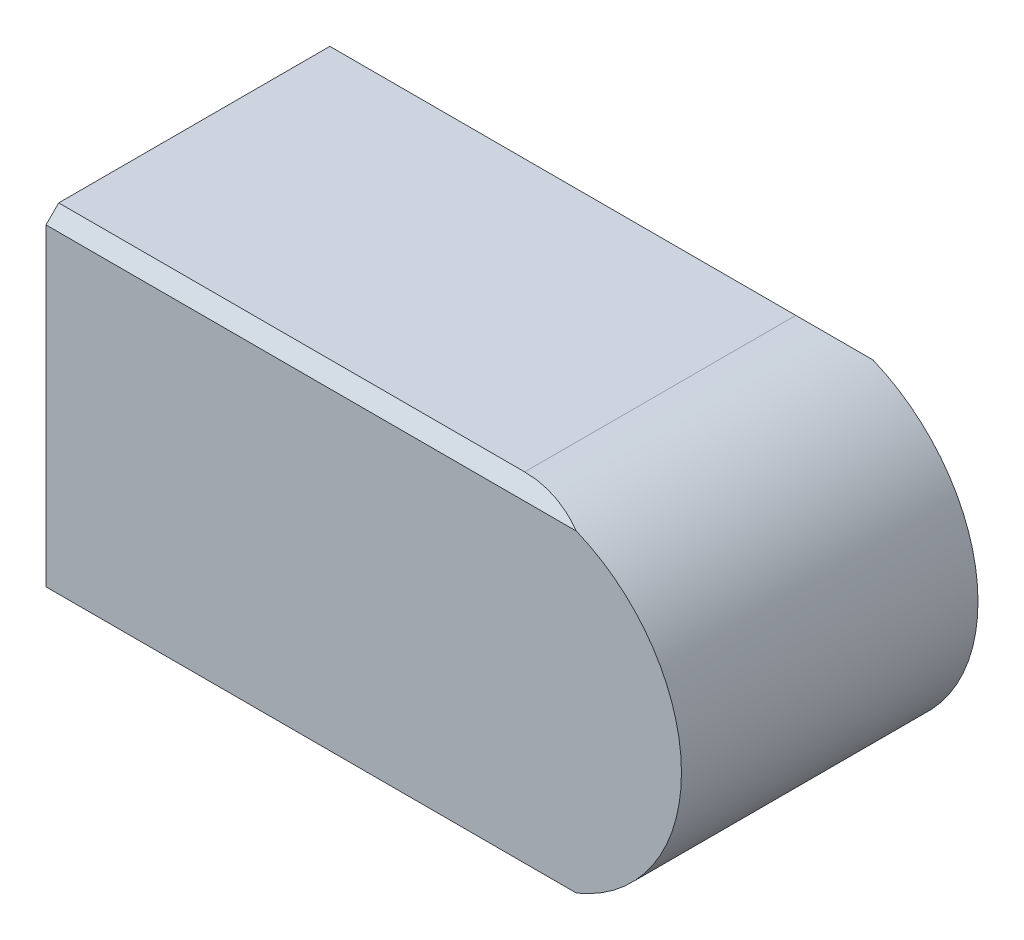
ISO-10303-21;
HEADER;
FILE_DESCRIPTION(('STEP AP214'),'2;1');
FILE_NAME('part.step','',(''),(''),'','','');
FILE_SCHEMA(('AUTOMOTIVE_DESIGN { 1 0 10303 214 1 1 1 1 }'));
ENDSEC;
DATA;
#1=APPLICATION_CONTEXT('core data for automotive mechanical design processes');
#2=APPLICATION_PROTOCOL_DEFINITION('international standard','automotive_design',2000,#1);
#3=PRODUCT_CONTEXT('',#1,'mechanical');
#4=PRODUCT('Part','Part','',(#3));
#5=PRODUCT_RELATED_PRODUCT_CATEGORY('part','',(#4));
#6=PRODUCT_DEFINITION_FORMATION('','',#4);
#7=PRODUCT_DEFINITION_CONTEXT('part definition',#1,'design');
#8=PRODUCT_DEFINITION('design','',#6,#7);
#9=PRODUCT_DEFINITION_SHAPE('','',#8);
#10=(LENGTH_UNIT() NAMED_UNIT(*) SI_UNIT(.MILLI.,.METRE.));
#11=(NAMED_UNIT(*) PLANE_ANGLE_UNIT() SI_UNIT($,.RADIAN.));
#12=(NAMED_UNIT(*) SI_UNIT($,.STERADIAN.) SOLID_ANGLE_UNIT());
#13=UNCERTAINTY_MEASURE_WITH_UNIT(LENGTH_MEASURE(1.E-05),#10,'distance_accuracy_value','');
#14=(GEOMETRIC_REPRESENTATION_CONTEXT(3) GLOBAL_UNCERTAINTY_ASSIGNED_CONTEXT((#13)) GLOBAL_UNIT_ASSIGNED_CONTEXT((#10,
#11,#12)) REPRESENTATION_CONTEXT('',''));
#15=CARTESIAN_POINT('',(0.,0.,0.));
#16=DIRECTION('',(0.,0.,1.));
#17=DIRECTION('',(1.,0.,0.));
#18=AXIS2_PLACEMENT_3D('',#15,#16,#17);
#19=CARTESIAN_POINT('',(15.,0.,0.3));
#20=DIRECTION('',(0.,0.707106781186547,0.707106781186548));
#21=DIRECTION('',(0.,-0.707106781186548,0.707106781186547));
#22=AXIS2_PLACEMENT_3D('',#19,#20,#21);
#23=PLANE('',#22);
#24=DIRECTION('',(0.,-0.707106781186548,0.707106781186547));
#25=VECTOR('',#24,1.);
#26=CARTESIAN_POINT('',(0.,0.,0.3));
#27=LINE('',#26,#25);
#28=CARTESIAN_POINT('',(0.,0.3,0.));
#29=VERTEX_POINT('',#28);
#30=CARTESIAN_POINT('',(0.,0.,0.299999999999992));
#31=VERTEX_POINT('',#30);
#32=EDGE_CURVE('E73',#29,#31,#27,.T.);
#33=ORIENTED_EDGE('',*,*,#32,.F.);
#34=DIRECTION('',(1.,0.,0.));
#35=VECTOR('',#34,1.);
#36=CARTESIAN_POINT('',(11.,0.3,0.));
#37=LINE('',#36,#35);
#38=CARTESIAN_POINT('',(12.519868415357,0.3,0.));
#39=VERTEX_POINT('',#38);
#40=EDGE_CURVE('E76',#29,#39,#37,.T.);
#41=ORIENTED_EDGE('',*,*,#40,.T.);
#42=CARTESIAN_POINT('',(11.,4.00000000000001,-3.7));
#43=DIRECTION('',(0.,0.707106781186547,0.707106781186548));
#44=DIRECTION('',(0.,-0.707106781186548,0.707106781186547));
#45=AXIS2_PLACEMENT_3D('',#42,#43,#44);
#46=ELLIPSE('',#45,5.65685424949236,3.99999999999999);
#47=CARTESIAN_POINT('',(11.,0.,0.29999999999998));
#48=VERTEX_POINT('',#47);
#49=EDGE_CURVE('E20',#48,#39,#46,.T.);
#50=ORIENTED_EDGE('',*,*,#49,.F.);
#51=DIRECTION('',(1.,0.,0.));
#52=VECTOR('',#51,1.);
#53=CARTESIAN_POINT('',(0.,0.,0.29999999999998));
#54=LINE('',#53,#52);
#55=EDGE_CURVE('E82',#48,#31,#54,.F.);
#56=ORIENTED_EDGE('',*,*,#55,.T.);
#57=EDGE_LOOP('',(#33,#41,#50,#56));
#58=FACE_BOUND('',#57,.T.);
#59=ADVANCED_FACE('F17',(#58),#23,.F.);
#60=CARTESIAN_POINT('',(15.,7.7,0.));
#61=DIRECTION('',(0.,-0.707106781186548,0.707106781186547));
#62=DIRECTION('',(0.,-0.707106781186547,-0.707106781186548));
#63=AXIS2_PLACEMENT_3D('',#60,#61,#62);
#64=PLANE('',#63);
#65=DIRECTION('',(0.,-0.707106781186547,-0.707106781186548));
#66=VECTOR('',#65,1.);
#67=CARTESIAN_POINT('',(0.,7.7,0.));
#68=LINE('',#67,#66);
#69=CARTESIAN_POINT('',(0.,8.,0.299999999999999));
#70=VERTEX_POINT('',#69);
#71=CARTESIAN_POINT('',(0.,7.70000000000001,0.));
#72=VERTEX_POINT('',#71);
#73=EDGE_CURVE('E100',#70,#72,#68,.T.);
#74=ORIENTED_EDGE('',*,*,#73,.F.);
#75=DIRECTION('',(1.,0.,0.));
#76=VECTOR('',#75,1.);
#77=CARTESIAN_POINT('',(11.,8.,0.3));
#78=LINE('',#77,#76);
#79=CARTESIAN_POINT('',(11.,8.,0.3));
#80=VERTEX_POINT('',#79);
#81=EDGE_CURVE('E104',#70,#80,#78,.T.);
#82=ORIENTED_EDGE('',*,*,#81,.T.);
#83=CARTESIAN_POINT('',(11.,4.00000000000001,-3.7));
#84=DIRECTION('',(0.,-0.707106781186548,0.707106781186547));
#85=DIRECTION('',(0.,0.707106781186547,0.707106781186548));
#86=AXIS2_PLACEMENT_3D('',#83,#84,#85);
#87=ELLIPSE('',#86,5.65685424949237,3.99999999999999);
#88=CARTESIAN_POINT('',(12.5198684153571,7.70000000000001,0.));
#89=VERTEX_POINT('',#88);
#90=EDGE_CURVE('E99',#89,#80,#87,.T.);
#91=ORIENTED_EDGE('',*,*,#90,.F.);
#92=DIRECTION('',(1.,0.,0.));
#93=VECTOR('',#92,1.);
#94=CARTESIAN_POINT('',(11.,7.70000000000001,0.));
#95=LINE('',#94,#93);
#96=EDGE_CURVE('E81',#89,#72,#95,.F.);
#97=ORIENTED_EDGE('',*,*,#96,.T.);
#98=EDGE_LOOP('',(#74,#82,#91,#97));
#99=FACE_BOUND('',#98,.T.);
#100=ADVANCED_FACE('F195',(#99),#64,.F.);
#101=CARTESIAN_POINT('',(11.,8.,7.));
#102=DIRECTION('',(0.,-1.,0.));
#103=DIRECTION('',(0.,0.,-1.));
#104=AXIS2_PLACEMENT_3D('',#101,#102,#103);
#105=PLANE('',#104);
#106=DIRECTION('',(1.,0.,0.));
#107=VECTOR('',#106,1.);
#108=CARTESIAN_POINT('',(15.,8.,6.7));
#109=LINE('',#108,#107);
#110=CARTESIAN_POINT('',(0.,8.,6.7));
#111=VERTEX_POINT('',#110);
#112=CARTESIAN_POINT('',(11.,8.,6.7));
#113=VERTEX_POINT('',#112);
#114=EDGE_CURVE('E129',#111,#113,#109,.T.);
#115=ORIENTED_EDGE('',*,*,#114,.T.);
#116=DIRECTION('',(0.,0.,1.));
#117=VECTOR('',#116,1.);
#118=CARTESIAN_POINT('',(11.,8.,7.));
#119=LINE('',#118,#117);
#120=EDGE_CURVE('E98',#80,#113,#119,.T.);
#121=ORIENTED_EDGE('',*,*,#120,.F.);
#122=ORIENTED_EDGE('',*,*,#81,.F.);
#123=DIRECTION('',(0.,0.,-1.));
#124=VECTOR('',#123,1.);
#125=CARTESIAN_POINT('',(0.,8.,7.));
#126=LINE('',#125,#124);
#127=EDGE_CURVE('E116',#70,#111,#126,.F.);
#128=ORIENTED_EDGE('',*,*,#127,.T.);
#129=EDGE_LOOP('',(#115,#121,#122,#128));
#130=FACE_BOUND('',#129,.T.);
#131=ADVANCED_FACE('F192',(#130),#105,.F.);
#132=CARTESIAN_POINT('',(0.,0.,7.));
#133=DIRECTION('',(0.,1.,0.));
#134=DIRECTION('',(0.,0.,1.));
#135=AXIS2_PLACEMENT_3D('',#132,#133,#134);
#136=PLANE('',#135);
#137=ORIENTED_EDGE('',*,*,#55,.F.);
#138=DIRECTION('',(0.,0.,1.));
#139=VECTOR('',#138,1.);
#140=CARTESIAN_POINT('',(11.,0.,7.));
#141=LINE('',#140,#139);
#142=CARTESIAN_POINT('',(11.,0.,6.70000000000001));
#143=VERTEX_POINT('',#142);
#144=EDGE_CURVE('E72',#143,#48,#141,.F.);
#145=ORIENTED_EDGE('',*,*,#144,.F.);
#146=DIRECTION('',(1.,0.,0.));
#147=VECTOR('',#146,1.);
#148=CARTESIAN_POINT('',(15.,0.,6.7));
#149=LINE('',#148,#147);
#150=CARTESIAN_POINT('',(0.,0.,6.7));
#151=VERTEX_POINT('',#150);
#152=EDGE_CURVE('E148',#143,#151,#149,.F.);
#153=ORIENTED_EDGE('',*,*,#152,.T.);
#154=DIRECTION('',(0.,0.,-1.));
#155=VECTOR('',#154,1.);
#156=CARTESIAN_POINT('',(0.,0.,7.));
#157=LINE('',#156,#155);
#158=EDGE_CURVE('E117',#151,#31,#157,.T.);
#159=ORIENTED_EDGE('',*,*,#158,.T.);
#160=EDGE_LOOP('',(#137,#145,#153,#159));
#161=FACE_BOUND('',#160,.T.);
#162=ADVANCED_FACE('F177',(#161),#136,.F.);
#163=CARTESIAN_POINT('',(11.,4.,0.));
#164=DIRECTION('',(0.,0.,1.));
#165=DIRECTION('',(1.,0.,0.));
#166=AXIS2_PLACEMENT_3D('',#163,#164,#165);
#167=PLANE('',#166);
#168=ORIENTED_EDGE('',*,*,#96,.F.);
#169=CARTESIAN_POINT('',(11.,4.00000000000001,0.));
#170=DIRECTION('',(0.,0.,1.));
#171=DIRECTION('',(1.,0.,0.));
#172=AXIS2_PLACEMENT_3D('',#169,#170,#171);
#173=CIRCLE('',#172,3.99999999999999);
#174=EDGE_CURVE('E70',#39,#89,#173,.T.);
#175=ORIENTED_EDGE('',*,*,#174,.F.);
#176=ORIENTED_EDGE('',*,*,#40,.F.);
#177=DIRECTION('',(0.,1.,0.));
#178=VECTOR('',#177,1.);
#179=CARTESIAN_POINT('',(0.,8.,0.));
#180=LINE('',#179,#178);
#181=EDGE_CURVE('E114',#29,#72,#180,.T.);
#182=ORIENTED_EDGE('',*,*,#181,.T.);
#183=EDGE_LOOP('',(#168,#175,#176,#182));
#184=FACE_BOUND('',#183,.T.);
#185=ADVANCED_FACE('F85',(#184),#167,.F.);
#186=CARTESIAN_POINT('',(15.,8.,6.7));
#187=DIRECTION('',(0.,-0.707106781186548,-0.707106781186548));
#188=DIRECTION('',(0.,0.707106781186548,-0.707106781186548));
#189=AXIS2_PLACEMENT_3D('',#186,#187,#188);
#190=PLANE('',#189);
#191=DIRECTION('',(0.,-0.707106781186547,0.707106781186547));
#192=VECTOR('',#191,1.);
#193=CARTESIAN_POINT('',(0.,8.,6.7));
#194=LINE('',#193,#192);
#195=CARTESIAN_POINT('',(0.,7.7,7.));
#196=VERTEX_POINT('',#195);
#197=EDGE_CURVE('E124',#111,#196,#194,.T.);
#198=ORIENTED_EDGE('',*,*,#197,.T.);
#199=DIRECTION('',(1.,0.,0.));
#200=VECTOR('',#199,1.);
#201=CARTESIAN_POINT('',(11.,7.7,7.));
#202=LINE('',#201,#200);
#203=CARTESIAN_POINT('',(12.5198684153571,7.7,7.));
#204=VERTEX_POINT('',#203);
#205=EDGE_CURVE('E87',#204,#196,#202,.F.);
#206=ORIENTED_EDGE('',*,*,#205,.F.);
#207=CARTESIAN_POINT('',(11.,4.00000000000001,10.7));
#208=DIRECTION('',(0.,-0.707106781186548,-0.707106781186548));
#209=DIRECTION('',(0.,-0.707106781186548,0.707106781186548));
#210=AXIS2_PLACEMENT_3D('',#207,#208,#209);
#211=ELLIPSE('',#210,5.65685424949237,3.99999999999999);
#212=EDGE_CURVE('E96',#113,#204,#211,.T.);
#213=ORIENTED_EDGE('',*,*,#212,.F.);
#214=ORIENTED_EDGE('',*,*,#114,.F.);
#215=EDGE_LOOP('',(#198,#206,#213,#214));
#216=FACE_BOUND('',#215,.T.);
#217=ADVANCED_FACE('F187',(#216),#190,.F.);
#218=CARTESIAN_POINT('',(0.,8.,7.));
#219=DIRECTION('',(1.,0.,0.));
#220=DIRECTION('',(0.,0.,-1.));
#221=AXIS2_PLACEMENT_3D('',#218,#219,#220);
#222=PLANE('',#221);
#223=ORIENTED_EDGE('',*,*,#197,.F.);
#224=ORIENTED_EDGE('',*,*,#127,.F.);
#225=ORIENTED_EDGE('',*,*,#73,.T.);
#226=ORIENTED_EDGE('',*,*,#181,.F.);
#227=ORIENTED_EDGE('',*,*,#32,.T.);
#228=ORIENTED_EDGE('',*,*,#158,.F.);
#229=DIRECTION('',(0.,0.707106781186547,0.707106781186548));
#230=VECTOR('',#229,1.);
#231=CARTESIAN_POINT('',(0.,0.3,7.));
#232=LINE('',#231,#230);
#233=CARTESIAN_POINT('',(0.,0.3,7.));
#234=VERTEX_POINT('',#233);
#235=EDGE_CURVE('E155',#151,#234,#232,.T.);
#236=ORIENTED_EDGE('',*,*,#235,.T.);
#237=DIRECTION('',(0.,1.,0.));
#238=VECTOR('',#237,1.);
#239=CARTESIAN_POINT('',(0.,4.,7.));
#240=LINE('',#239,#238);
#241=EDGE_CURVE('E90',#196,#234,#240,.F.);
#242=ORIENTED_EDGE('',*,*,#241,.F.);
#243=EDGE_LOOP('',(#223,#224,#225,#226,#227,#228,#236,#242));
#244=FACE_BOUND('',#243,.T.);
#245=ADVANCED_FACE('F175',(#244),#222,.F.);
#246=CARTESIAN_POINT('',(15.,0.3,7.));
#247=DIRECTION('',(0.,0.707106781186548,-0.707106781186547));
#248=DIRECTION('',(0.,0.707106781186547,0.707106781186548));
#249=AXIS2_PLACEMENT_3D('',#246,#247,#248);
#250=PLANE('',#249);
#251=ORIENTED_EDGE('',*,*,#235,.F.);
#252=ORIENTED_EDGE('',*,*,#152,.F.);
#253=CARTESIAN_POINT('',(11.,4.00000000000001,10.7));
#254=DIRECTION('',(0.,0.707106781186548,-0.707106781186547));
#255=DIRECTION('',(0.,0.707106781186547,0.707106781186548));
#256=AXIS2_PLACEMENT_3D('',#253,#254,#255);
#257=ELLIPSE('',#256,5.65685424949237,3.99999999999999);
#258=CARTESIAN_POINT('',(12.519868415357,0.3,7.));
#259=VERTEX_POINT('',#258);
#260=EDGE_CURVE('E35',#259,#143,#257,.T.);
#261=ORIENTED_EDGE('',*,*,#260,.F.);
#262=DIRECTION('',(1.,0.,0.));
#263=VECTOR('',#262,1.);
#264=CARTESIAN_POINT('',(11.,0.3,7.));
#265=LINE('',#264,#263);
#266=EDGE_CURVE('E26',#234,#259,#265,.T.);
#267=ORIENTED_EDGE('',*,*,#266,.F.);
#268=EDGE_LOOP('',(#251,#252,#261,#267));
#269=FACE_BOUND('',#268,.T.);
#270=ADVANCED_FACE('F171',(#269),#250,.F.);
#271=CARTESIAN_POINT('',(11.,4.00000000000001,7.));
#272=DIRECTION('',(0.,0.,1.));
#273=DIRECTION('',(1.,0.,0.));
#274=AXIS2_PLACEMENT_3D('',#271,#272,#273);
#275=CYLINDRICAL_SURFACE('',#274,3.99999999999999);
#276=ORIENTED_EDGE('',*,*,#174,.T.);
#277=ORIENTED_EDGE('',*,*,#90,.T.);
#278=ORIENTED_EDGE('',*,*,#120,.T.);
#279=ORIENTED_EDGE('',*,*,#212,.T.);
#280=CARTESIAN_POINT('',(11.,4.00000000000001,7.));
#281=DIRECTION('',(0.,0.,1.));
#282=DIRECTION('',(1.,0.,0.));
#283=AXIS2_PLACEMENT_3D('',#280,#281,#282);
#284=CIRCLE('',#283,3.99999999999999);
#285=EDGE_CURVE('E11',#259,#204,#284,.T.);
#286=ORIENTED_EDGE('',*,*,#285,.F.);
#287=ORIENTED_EDGE('',*,*,#260,.T.);
#288=ORIENTED_EDGE('',*,*,#144,.T.);
#289=ORIENTED_EDGE('',*,*,#49,.T.);
#290=EDGE_LOOP('',(#276,#277,#278,#279,#286,#287,#288,#289));
#291=FACE_BOUND('',#290,.T.);
#292=ADVANCED_FACE('F68',(#291),#275,.T.);
#293=CARTESIAN_POINT('',(11.,4.,7.));
#294=DIRECTION('',(0.,0.,1.));
#295=DIRECTION('',(1.,0.,0.));
#296=AXIS2_PLACEMENT_3D('',#293,#294,#295);
#297=PLANE('',#296);
#298=ORIENTED_EDGE('',*,*,#266,.T.);
#299=ORIENTED_EDGE('',*,*,#285,.T.);
#300=ORIENTED_EDGE('',*,*,#205,.T.);
#301=ORIENTED_EDGE('',*,*,#241,.T.);
#302=EDGE_LOOP('',(#298,#299,#300,#301));
#303=FACE_BOUND('',#302,.T.);
#304=ADVANCED_FACE('F168',(#303),#297,.T.);
#305=CLOSED_SHELL('',(#59,#100,#131,#162,#185,#217,#245,#270,#292,#304));
#306=MANIFOLD_SOLID_BREP('B1',#305);
#307=ADVANCED_BREP_SHAPE_REPRESENTATION('',(#18,#306),#14);
#308=SHAPE_DEFINITION_REPRESENTATION(#9,#307);
ENDSEC;
END-ISO-10303-21;
